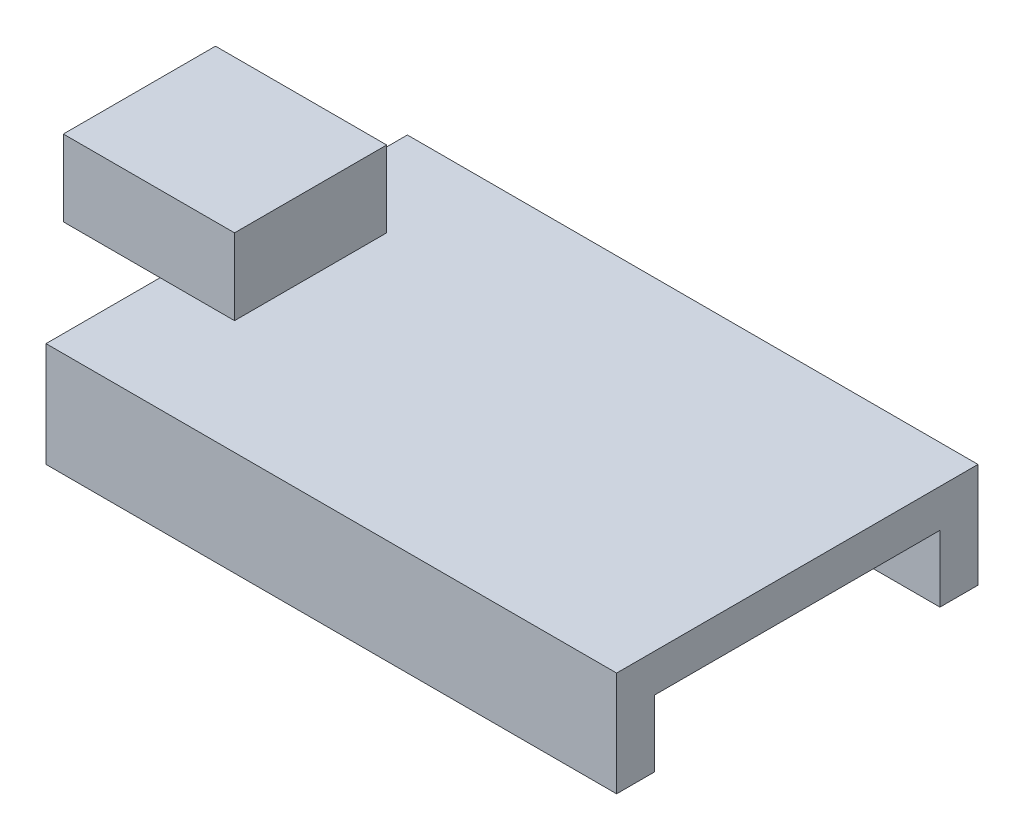
ISO-10303-21;
HEADER;
FILE_DESCRIPTION(('STEP AP214'),'2;1');
FILE_NAME('part.step','',(''),(''),'','','');
FILE_SCHEMA(('AUTOMOTIVE_DESIGN { 1 0 10303 214 1 1 1 1 }'));
ENDSEC;
DATA;
#1=APPLICATION_CONTEXT('core data for automotive mechanical design processes');
#2=APPLICATION_PROTOCOL_DEFINITION('international standard','automotive_design',2000,#1);
#3=PRODUCT_CONTEXT('',#1,'mechanical');
#4=PRODUCT('Part','Part','',(#3));
#5=PRODUCT_RELATED_PRODUCT_CATEGORY('part','',(#4));
#6=PRODUCT_DEFINITION_FORMATION('','',#4);
#7=PRODUCT_DEFINITION_CONTEXT('part definition',#1,'design');
#8=PRODUCT_DEFINITION('design','',#6,#7);
#9=PRODUCT_DEFINITION_SHAPE('','',#8);
#10=(LENGTH_UNIT() NAMED_UNIT(*) SI_UNIT(.MILLI.,.METRE.));
#11=(NAMED_UNIT(*) PLANE_ANGLE_UNIT() SI_UNIT($,.RADIAN.));
#12=(NAMED_UNIT(*) SI_UNIT($,.STERADIAN.) SOLID_ANGLE_UNIT());
#13=UNCERTAINTY_MEASURE_WITH_UNIT(LENGTH_MEASURE(1.E-05),#10,'distance_accuracy_value','');
#14=(GEOMETRIC_REPRESENTATION_CONTEXT(3) GLOBAL_UNCERTAINTY_ASSIGNED_CONTEXT((#13)) GLOBAL_UNIT_ASSIGNED_CONTEXT((#10,
#11,#12)) REPRESENTATION_CONTEXT('',''));
#15=CARTESIAN_POINT('',(0.,0.,0.));
#16=DIRECTION('',(0.,0.,1.));
#17=DIRECTION('',(1.,0.,0.));
#18=AXIS2_PLACEMENT_3D('',#15,#16,#17);
#19=CARTESIAN_POINT('',(0.,3.5,0.));
#20=DIRECTION('',(0.,1.,0.));
#21=DIRECTION('',(0.,0.,1.));
#22=AXIS2_PLACEMENT_3D('',#19,#20,#21);
#23=PLANE('',#22);
#24=DIRECTION('',(-1.,0.,0.));
#25=VECTOR('',#24,1.);
#26=CARTESIAN_POINT('',(0.,3.5,17.));
#27=LINE('',#26,#25);
#28=CARTESIAN_POINT('',(30.,3.5,17.));
#29=VERTEX_POINT('',#28);
#30=CARTESIAN_POINT('',(0.,3.5,17.));
#31=VERTEX_POINT('',#30);
#32=EDGE_CURVE('E182',#29,#31,#27,.T.);
#33=ORIENTED_EDGE('',*,*,#32,.T.);
#34=DIRECTION('',(0.,0.,1.));
#35=VECTOR('',#34,1.);
#36=CARTESIAN_POINT('',(0.,3.5,0.));
#37=LINE('',#36,#35);
#38=CARTESIAN_POINT('',(0.,3.5,2.));
#39=VERTEX_POINT('',#38);
#40=EDGE_CURVE('E197',#39,#31,#37,.T.);
#41=ORIENTED_EDGE('',*,*,#40,.F.);
#42=DIRECTION('',(1.,0.,0.));
#43=VECTOR('',#42,1.);
#44=CARTESIAN_POINT('',(0.,3.5,2.));
#45=LINE('',#44,#43);
#46=CARTESIAN_POINT('',(30.,3.5,2.));
#47=VERTEX_POINT('',#46);
#48=EDGE_CURVE('E230',#39,#47,#45,.T.);
#49=ORIENTED_EDGE('',*,*,#48,.T.);
#50=DIRECTION('',(0.,0.,-1.));
#51=VECTOR('',#50,1.);
#52=CARTESIAN_POINT('',(30.,3.5,0.));
#53=LINE('',#52,#51);
#54=EDGE_CURVE('E221',#29,#47,#53,.T.);
#55=ORIENTED_EDGE('',*,*,#54,.F.);
#56=EDGE_LOOP('',(#33,#41,#49,#55));
#57=FACE_BOUND('',#56,.T.);
#58=ADVANCED_FACE('F44',(#57),#23,.F.);
#59=CARTESIAN_POINT('',(0.,3.5,0.));
#60=DIRECTION('',(1.,0.,0.));
#61=DIRECTION('',(0.,0.,-1.));
#62=AXIS2_PLACEMENT_3D('',#59,#60,#61);
#63=PLANE('',#62);
#64=DIRECTION('',(0.,0.,1.));
#65=VECTOR('',#64,1.);
#66=CARTESIAN_POINT('',(0.,0.,0.));
#67=LINE('',#66,#65);
#68=CARTESIAN_POINT('',(0.,0.,0.));
#69=VERTEX_POINT('',#68);
#70=CARTESIAN_POINT('',(0.,0.,2.));
#71=VERTEX_POINT('',#70);
#72=EDGE_CURVE('E229',#69,#71,#67,.T.);
#73=ORIENTED_EDGE('',*,*,#72,.T.);
#74=DIRECTION('',(0.,-1.,0.));
#75=VECTOR('',#74,1.);
#76=CARTESIAN_POINT('',(0.,3.5,2.));
#77=LINE('',#76,#75);
#78=EDGE_CURVE('E48',#39,#71,#77,.T.);
#79=ORIENTED_EDGE('',*,*,#78,.F.);
#80=ORIENTED_EDGE('',*,*,#40,.T.);
#81=DIRECTION('',(0.,-1.,0.));
#82=VECTOR('',#81,1.);
#83=CARTESIAN_POINT('',(0.,3.5,17.));
#84=LINE('',#83,#82);
#85=CARTESIAN_POINT('',(0.,0.,17.));
#86=VERTEX_POINT('',#85);
#87=EDGE_CURVE('E173',#31,#86,#84,.T.);
#88=ORIENTED_EDGE('',*,*,#87,.T.);
#89=DIRECTION('',(0.,0.,1.));
#90=VECTOR('',#89,1.);
#91=CARTESIAN_POINT('',(0.,0.,17.));
#92=LINE('',#91,#90);
#93=CARTESIAN_POINT('',(0.,0.,19.));
#94=VERTEX_POINT('',#93);
#95=EDGE_CURVE('E193',#86,#94,#92,.T.);
#96=ORIENTED_EDGE('',*,*,#95,.T.);
#97=DIRECTION('',(0.,-1.,0.));
#98=VECTOR('',#97,1.);
#99=CARTESIAN_POINT('',(0.,5.5,19.));
#100=LINE('',#99,#98);
#101=CARTESIAN_POINT('',(0.,5.5,19.));
#102=VERTEX_POINT('',#101);
#103=EDGE_CURVE('E226',#102,#94,#100,.T.);
#104=ORIENTED_EDGE('',*,*,#103,.F.);
#105=DIRECTION('',(0.,0.,1.));
#106=VECTOR('',#105,1.);
#107=CARTESIAN_POINT('',(0.,5.5,0.));
#108=LINE('',#107,#106);
#109=CARTESIAN_POINT('',(0.,5.5,13.));
#110=VERTEX_POINT('',#109);
#111=EDGE_CURVE('E206',#110,#102,#108,.T.);
#112=ORIENTED_EDGE('',*,*,#111,.F.);
#113=CARTESIAN_POINT('',(0.,5.5,5.));
#114=VERTEX_POINT('',#113);
#115=EDGE_CURVE('E205',#114,#110,#108,.T.);
#116=ORIENTED_EDGE('',*,*,#115,.F.);
#117=CARTESIAN_POINT('',(0.,5.5,0.));
#118=VERTEX_POINT('',#117);
#119=EDGE_CURVE('E201',#118,#114,#108,.T.);
#120=ORIENTED_EDGE('',*,*,#119,.F.);
#121=DIRECTION('',(0.,-1.,0.));
#122=VECTOR('',#121,1.);
#123=CARTESIAN_POINT('',(0.,3.5,0.));
#124=LINE('',#123,#122);
#125=EDGE_CURVE('E234',#118,#69,#124,.T.);
#126=ORIENTED_EDGE('',*,*,#125,.T.);
#127=EDGE_LOOP('',(#73,#79,#80,#88,#96,#104,#112,#116,#120,#126));
#128=FACE_BOUND('',#127,.T.);
#129=ADVANCED_FACE('F46',(#128),#63,.F.);
#130=CARTESIAN_POINT('',(0.,3.5,2.));
#131=DIRECTION('',(0.,0.,-1.));
#132=DIRECTION('',(-1.,0.,0.));
#133=AXIS2_PLACEMENT_3D('',#130,#131,#132);
#134=PLANE('',#133);
#135=DIRECTION('',(1.,0.,0.));
#136=VECTOR('',#135,1.);
#137=CARTESIAN_POINT('',(0.,0.,2.));
#138=LINE('',#137,#136);
#139=CARTESIAN_POINT('',(30.,0.,2.));
#140=VERTEX_POINT('',#139);
#141=EDGE_CURVE('E239',#71,#140,#138,.T.);
#142=ORIENTED_EDGE('',*,*,#141,.T.);
#143=DIRECTION('',(0.,-1.,0.));
#144=VECTOR('',#143,1.);
#145=CARTESIAN_POINT('',(30.,3.5,2.));
#146=LINE('',#145,#144);
#147=EDGE_CURVE('E253',#47,#140,#146,.T.);
#148=ORIENTED_EDGE('',*,*,#147,.F.);
#149=ORIENTED_EDGE('',*,*,#48,.F.);
#150=ORIENTED_EDGE('',*,*,#78,.T.);
#151=EDGE_LOOP('',(#142,#148,#149,#150));
#152=FACE_BOUND('',#151,.T.);
#153=ADVANCED_FACE('F263',(#152),#134,.F.);
#154=CARTESIAN_POINT('',(30.,3.5,0.));
#155=DIRECTION('',(-1.,0.,0.));
#156=DIRECTION('',(0.,0.,1.));
#157=AXIS2_PLACEMENT_3D('',#154,#155,#156);
#158=PLANE('',#157);
#159=DIRECTION('',(0.,0.,-1.));
#160=VECTOR('',#159,1.);
#161=CARTESIAN_POINT('',(30.,0.,0.));
#162=LINE('',#161,#160);
#163=CARTESIAN_POINT('',(30.,0.,0.));
#164=VERTEX_POINT('',#163);
#165=EDGE_CURVE('E242',#140,#164,#162,.T.);
#166=ORIENTED_EDGE('',*,*,#165,.T.);
#167=DIRECTION('',(0.,-1.,0.));
#168=VECTOR('',#167,1.);
#169=CARTESIAN_POINT('',(30.,3.5,0.));
#170=LINE('',#169,#168);
#171=CARTESIAN_POINT('',(30.,5.5,0.));
#172=VERTEX_POINT('',#171);
#173=EDGE_CURVE('E250',#172,#164,#170,.T.);
#174=ORIENTED_EDGE('',*,*,#173,.F.);
#175=DIRECTION('',(0.,0.,-1.));
#176=VECTOR('',#175,1.);
#177=CARTESIAN_POINT('',(30.,5.5,0.));
#178=LINE('',#177,#176);
#179=CARTESIAN_POINT('',(30.,5.5,19.));
#180=VERTEX_POINT('',#179);
#181=EDGE_CURVE('E209',#180,#172,#178,.T.);
#182=ORIENTED_EDGE('',*,*,#181,.F.);
#183=DIRECTION('',(0.,-1.,0.));
#184=VECTOR('',#183,1.);
#185=CARTESIAN_POINT('',(30.,5.5,19.));
#186=LINE('',#185,#184);
#187=CARTESIAN_POINT('',(30.,0.,19.));
#188=VERTEX_POINT('',#187);
#189=EDGE_CURVE('E217',#180,#188,#186,.T.);
#190=ORIENTED_EDGE('',*,*,#189,.T.);
#191=DIRECTION('',(0.,0.,-1.));
#192=VECTOR('',#191,1.);
#193=CARTESIAN_POINT('',(30.,0.,17.));
#194=LINE('',#193,#192);
#195=CARTESIAN_POINT('',(30.,0.,17.));
#196=VERTEX_POINT('',#195);
#197=EDGE_CURVE('E186',#188,#196,#194,.T.);
#198=ORIENTED_EDGE('',*,*,#197,.T.);
#199=DIRECTION('',(0.,-1.,0.));
#200=VECTOR('',#199,1.);
#201=CARTESIAN_POINT('',(30.,3.5,17.));
#202=LINE('',#201,#200);
#203=EDGE_CURVE('E168',#29,#196,#202,.T.);
#204=ORIENTED_EDGE('',*,*,#203,.F.);
#205=ORIENTED_EDGE('',*,*,#54,.T.);
#206=ORIENTED_EDGE('',*,*,#147,.T.);
#207=EDGE_LOOP('',(#166,#174,#182,#190,#198,#204,#205,#206));
#208=FACE_BOUND('',#207,.T.);
#209=ADVANCED_FACE('F271',(#208),#158,.F.);
#210=CARTESIAN_POINT('',(0.,3.5,0.));
#211=DIRECTION('',(0.,0.,1.));
#212=DIRECTION('',(1.,0.,0.));
#213=AXIS2_PLACEMENT_3D('',#210,#211,#212);
#214=PLANE('',#213);
#215=DIRECTION('',(-1.,0.,0.));
#216=VECTOR('',#215,1.);
#217=CARTESIAN_POINT('',(0.,0.,0.));
#218=LINE('',#217,#216);
#219=EDGE_CURVE('E235',#164,#69,#218,.T.);
#220=ORIENTED_EDGE('',*,*,#219,.T.);
#221=ORIENTED_EDGE('',*,*,#125,.F.);
#222=DIRECTION('',(-1.,0.,0.));
#223=VECTOR('',#222,1.);
#224=CARTESIAN_POINT('',(0.,5.5,0.));
#225=LINE('',#224,#223);
#226=EDGE_CURVE('E213',#172,#118,#225,.T.);
#227=ORIENTED_EDGE('',*,*,#226,.F.);
#228=ORIENTED_EDGE('',*,*,#173,.T.);
#229=EDGE_LOOP('',(#220,#221,#227,#228));
#230=FACE_BOUND('',#229,.T.);
#231=ADVANCED_FACE('F275',(#230),#214,.F.);
#232=CARTESIAN_POINT('',(0.,0.,0.));
#233=DIRECTION('',(0.,1.,0.));
#234=DIRECTION('',(0.,0.,1.));
#235=AXIS2_PLACEMENT_3D('',#232,#233,#234);
#236=PLANE('',#235);
#237=ORIENTED_EDGE('',*,*,#72,.F.);
#238=ORIENTED_EDGE('',*,*,#219,.F.);
#239=ORIENTED_EDGE('',*,*,#165,.F.);
#240=ORIENTED_EDGE('',*,*,#141,.F.);
#241=EDGE_LOOP('',(#237,#238,#239,#240));
#242=FACE_BOUND('',#241,.T.);
#243=ADVANCED_FACE('F270',(#242),#236,.F.);
#244=CARTESIAN_POINT('',(0.,5.5,19.));
#245=DIRECTION('',(0.,0.,-1.));
#246=DIRECTION('',(-1.,0.,0.));
#247=AXIS2_PLACEMENT_3D('',#244,#245,#246);
#248=PLANE('',#247);
#249=ORIENTED_EDGE('',*,*,#103,.T.);
#250=DIRECTION('',(1.,0.,0.));
#251=VECTOR('',#250,1.);
#252=CARTESIAN_POINT('',(0.,0.,19.));
#253=LINE('',#252,#251);
#254=EDGE_CURVE('E189',#94,#188,#253,.T.);
#255=ORIENTED_EDGE('',*,*,#254,.T.);
#256=ORIENTED_EDGE('',*,*,#189,.F.);
#257=DIRECTION('',(1.,0.,0.));
#258=VECTOR('',#257,1.);
#259=CARTESIAN_POINT('',(0.,5.5,19.));
#260=LINE('',#259,#258);
#261=EDGE_CURVE('E204',#102,#180,#260,.T.);
#262=ORIENTED_EDGE('',*,*,#261,.F.);
#263=EDGE_LOOP('',(#249,#255,#256,#262));
#264=FACE_BOUND('',#263,.T.);
#265=ADVANCED_FACE('F286',(#264),#248,.F.);
#266=CARTESIAN_POINT('',(0.,5.5,0.));
#267=DIRECTION('',(0.,1.,0.));
#268=DIRECTION('',(0.,0.,1.));
#269=AXIS2_PLACEMENT_3D('',#266,#267,#268);
#270=PLANE('',#269);
#271=DIRECTION('',(-1.,0.,0.));
#272=VECTOR('',#271,1.);
#273=CARTESIAN_POINT('',(-5.08792265394107,5.5,5.));
#274=LINE('',#273,#272);
#275=CARTESIAN_POINT('',(3.91207734605892,5.5,5.));
#276=VERTEX_POINT('',#275);
#277=EDGE_CURVE('E62',#276,#114,#274,.T.);
#278=ORIENTED_EDGE('',*,*,#277,.F.);
#279=DIRECTION('',(0.,0.,-1.));
#280=VECTOR('',#279,1.);
#281=CARTESIAN_POINT('',(3.91207734605892,5.5,5.));
#282=LINE('',#281,#280);
#283=CARTESIAN_POINT('',(3.91207734605893,5.5,13.));
#284=VERTEX_POINT('',#283);
#285=EDGE_CURVE('E513',#284,#276,#282,.T.);
#286=ORIENTED_EDGE('',*,*,#285,.F.);
#287=DIRECTION('',(1.,0.,0.));
#288=VECTOR('',#287,1.);
#289=CARTESIAN_POINT('',(-5.08792265394107,5.5,13.));
#290=LINE('',#289,#288);
#291=EDGE_CURVE('E11',#110,#284,#290,.T.);
#292=ORIENTED_EDGE('',*,*,#291,.F.);
#293=ORIENTED_EDGE('',*,*,#111,.T.);
#294=ORIENTED_EDGE('',*,*,#261,.T.);
#295=ORIENTED_EDGE('',*,*,#181,.T.);
#296=ORIENTED_EDGE('',*,*,#226,.T.);
#297=ORIENTED_EDGE('',*,*,#119,.T.);
#298=EDGE_LOOP('',(#278,#286,#292,#293,#294,#295,#296,#297));
#299=FACE_BOUND('',#298,.T.);
#300=ADVANCED_FACE('F276',(#299),#270,.T.);
#301=CARTESIAN_POINT('',(0.,3.5,17.));
#302=DIRECTION('',(0.,0.,1.));
#303=DIRECTION('',(1.,0.,0.));
#304=AXIS2_PLACEMENT_3D('',#301,#302,#303);
#305=PLANE('',#304);
#306=DIRECTION('',(-1.,0.,0.));
#307=VECTOR('',#306,1.);
#308=CARTESIAN_POINT('',(0.,0.,17.));
#309=LINE('',#308,#307);
#310=EDGE_CURVE('E183',#196,#86,#309,.T.);
#311=ORIENTED_EDGE('',*,*,#310,.T.);
#312=ORIENTED_EDGE('',*,*,#87,.F.);
#313=ORIENTED_EDGE('',*,*,#32,.F.);
#314=ORIENTED_EDGE('',*,*,#203,.T.);
#315=EDGE_LOOP('',(#311,#312,#313,#314));
#316=FACE_BOUND('',#315,.T.);
#317=ADVANCED_FACE('F295',(#316),#305,.F.);
#318=CARTESIAN_POINT('',(0.,0.,0.));
#319=DIRECTION('',(0.,1.,0.));
#320=DIRECTION('',(0.,0.,1.));
#321=AXIS2_PLACEMENT_3D('',#318,#319,#320);
#322=PLANE('',#321);
#323=ORIENTED_EDGE('',*,*,#95,.F.);
#324=ORIENTED_EDGE('',*,*,#310,.F.);
#325=ORIENTED_EDGE('',*,*,#197,.F.);
#326=ORIENTED_EDGE('',*,*,#254,.F.);
#327=EDGE_LOOP('',(#323,#324,#325,#326));
#328=FACE_BOUND('',#327,.T.);
#329=ADVANCED_FACE('F291',(#328),#322,.F.);
#330=CARTESIAN_POINT('',(0.,5.5,0.));
#331=DIRECTION('',(0.,1.,0.));
#332=DIRECTION('',(0.,0.,1.));
#333=AXIS2_PLACEMENT_3D('',#330,#331,#332);
#334=PLANE('',#333);
#335=CARTESIAN_POINT('',(-5.08792265394107,5.5,5.));
#336=VERTEX_POINT('',#335);
#337=EDGE_CURVE('E508',#114,#336,#274,.T.);
#338=ORIENTED_EDGE('',*,*,#337,.F.);
#339=ORIENTED_EDGE('',*,*,#115,.T.);
#340=CARTESIAN_POINT('',(-5.08792265394107,5.5,13.));
#341=VERTEX_POINT('',#340);
#342=EDGE_CURVE('E55',#341,#110,#290,.T.);
#343=ORIENTED_EDGE('',*,*,#342,.F.);
#344=DIRECTION('',(0.,0.,1.));
#345=VECTOR('',#344,1.);
#346=CARTESIAN_POINT('',(-5.08792265394107,5.5,5.));
#347=LINE('',#346,#345);
#348=EDGE_CURVE('E166',#336,#341,#347,.T.);
#349=ORIENTED_EDGE('',*,*,#348,.F.);
#350=EDGE_LOOP('',(#338,#339,#343,#349));
#351=FACE_BOUND('',#350,.T.);
#352=ADVANCED_FACE('F353',(#351),#334,.F.);
#353=CARTESIAN_POINT('',(-5.08792265394107,9.5,5.));
#354=DIRECTION('',(1.,0.,0.));
#355=DIRECTION('',(0.,0.,-1.));
#356=AXIS2_PLACEMENT_3D('',#353,#354,#355);
#357=PLANE('',#356);
#358=ORIENTED_EDGE('',*,*,#348,.T.);
#359=DIRECTION('',(0.,-1.,0.));
#360=VECTOR('',#359,1.);
#361=CARTESIAN_POINT('',(-5.08792265394107,9.5,13.));
#362=LINE('',#361,#360);
#363=CARTESIAN_POINT('',(-5.08792265394107,9.5,13.));
#364=VERTEX_POINT('',#363);
#365=EDGE_CURVE('E145',#364,#341,#362,.T.);
#366=ORIENTED_EDGE('',*,*,#365,.F.);
#367=DIRECTION('',(0.,0.,1.));
#368=VECTOR('',#367,1.);
#369=CARTESIAN_POINT('',(-5.08792265394107,9.5,5.));
#370=LINE('',#369,#368);
#371=CARTESIAN_POINT('',(-5.08792265394107,9.5,5.));
#372=VERTEX_POINT('',#371);
#373=EDGE_CURVE('E153',#372,#364,#370,.T.);
#374=ORIENTED_EDGE('',*,*,#373,.F.);
#375=DIRECTION('',(0.,-1.,0.));
#376=VECTOR('',#375,1.);
#377=CARTESIAN_POINT('',(-5.08792265394107,9.5,5.));
#378=LINE('',#377,#376);
#379=EDGE_CURVE('E516',#372,#336,#378,.T.);
#380=ORIENTED_EDGE('',*,*,#379,.T.);
#381=EDGE_LOOP('',(#358,#366,#374,#380));
#382=FACE_BOUND('',#381,.T.);
#383=ADVANCED_FACE('F164',(#382),#357,.F.);
#384=CARTESIAN_POINT('',(-5.08792265394107,9.5,13.));
#385=DIRECTION('',(0.,0.,-1.));
#386=DIRECTION('',(-1.,0.,0.));
#387=AXIS2_PLACEMENT_3D('',#384,#385,#386);
#388=PLANE('',#387);
#389=ORIENTED_EDGE('',*,*,#342,.T.);
#390=ORIENTED_EDGE('',*,*,#291,.T.);
#391=DIRECTION('',(0.,-1.,0.));
#392=VECTOR('',#391,1.);
#393=CARTESIAN_POINT('',(3.91207734605893,9.5,13.));
#394=LINE('',#393,#392);
#395=CARTESIAN_POINT('',(3.91207734605893,9.5,13.));
#396=VERTEX_POINT('',#395);
#397=EDGE_CURVE('E148',#396,#284,#394,.T.);
#398=ORIENTED_EDGE('',*,*,#397,.F.);
#399=DIRECTION('',(1.,0.,0.));
#400=VECTOR('',#399,1.);
#401=CARTESIAN_POINT('',(-5.08792265394107,9.5,13.));
#402=LINE('',#401,#400);
#403=EDGE_CURVE('E140',#364,#396,#402,.T.);
#404=ORIENTED_EDGE('',*,*,#403,.F.);
#405=ORIENTED_EDGE('',*,*,#365,.T.);
#406=EDGE_LOOP('',(#389,#390,#398,#404,#405));
#407=FACE_BOUND('',#406,.T.);
#408=ADVANCED_FACE('F143',(#407),#388,.F.);
#409=CARTESIAN_POINT('',(3.91207734605892,9.5,5.));
#410=DIRECTION('',(-1.,0.,0.));
#411=DIRECTION('',(0.,0.,1.));
#412=AXIS2_PLACEMENT_3D('',#409,#410,#411);
#413=PLANE('',#412);
#414=ORIENTED_EDGE('',*,*,#285,.T.);
#415=DIRECTION('',(0.,-1.,0.));
#416=VECTOR('',#415,1.);
#417=CARTESIAN_POINT('',(3.91207734605892,9.5,5.));
#418=LINE('',#417,#416);
#419=CARTESIAN_POINT('',(3.91207734605892,9.5,5.));
#420=VERTEX_POINT('',#419);
#421=EDGE_CURVE('E175',#420,#276,#418,.T.);
#422=ORIENTED_EDGE('',*,*,#421,.F.);
#423=DIRECTION('',(0.,0.,-1.));
#424=VECTOR('',#423,1.);
#425=CARTESIAN_POINT('',(3.91207734605892,9.5,5.));
#426=LINE('',#425,#424);
#427=EDGE_CURVE('E152',#396,#420,#426,.T.);
#428=ORIENTED_EDGE('',*,*,#427,.F.);
#429=ORIENTED_EDGE('',*,*,#397,.T.);
#430=EDGE_LOOP('',(#414,#422,#428,#429));
#431=FACE_BOUND('',#430,.T.);
#432=ADVANCED_FACE('F373',(#431),#413,.F.);
#433=CARTESIAN_POINT('',(-5.08792265394107,9.5,5.));
#434=DIRECTION('',(0.,0.,1.));
#435=DIRECTION('',(1.,0.,0.));
#436=AXIS2_PLACEMENT_3D('',#433,#434,#435);
#437=PLANE('',#436);
#438=ORIENTED_EDGE('',*,*,#277,.T.);
#439=ORIENTED_EDGE('',*,*,#337,.T.);
#440=ORIENTED_EDGE('',*,*,#379,.F.);
#441=DIRECTION('',(-1.,0.,0.));
#442=VECTOR('',#441,1.);
#443=CARTESIAN_POINT('',(-5.08792265394107,9.5,5.));
#444=LINE('',#443,#442);
#445=EDGE_CURVE('E158',#420,#372,#444,.T.);
#446=ORIENTED_EDGE('',*,*,#445,.F.);
#447=ORIENTED_EDGE('',*,*,#421,.T.);
#448=EDGE_LOOP('',(#438,#439,#440,#446,#447));
#449=FACE_BOUND('',#448,.T.);
#450=ADVANCED_FACE('F380',(#449),#437,.F.);
#451=CARTESIAN_POINT('',(0.,9.5,0.));
#452=DIRECTION('',(0.,1.,0.));
#453=DIRECTION('',(0.,0.,1.));
#454=AXIS2_PLACEMENT_3D('',#451,#452,#453);
#455=PLANE('',#454);
#456=ORIENTED_EDGE('',*,*,#373,.T.);
#457=ORIENTED_EDGE('',*,*,#403,.T.);
#458=ORIENTED_EDGE('',*,*,#427,.T.);
#459=ORIENTED_EDGE('',*,*,#445,.T.);
#460=EDGE_LOOP('',(#456,#457,#458,#459));
#461=FACE_BOUND('',#460,.T.);
#462=ADVANCED_FACE('F156',(#461),#455,.T.);
#463=CLOSED_SHELL('',(#58,#129,#153,#209,#231,#243,#265,#300,#317,#329,#352,#383,#408,#432,#450,#462));
#464=MANIFOLD_SOLID_BREP('B2',#463);
#465=ADVANCED_BREP_SHAPE_REPRESENTATION('',(#18,#464),#14);
#466=SHAPE_DEFINITION_REPRESENTATION(#9,#465);
ENDSEC;
END-ISO-10303-21;
